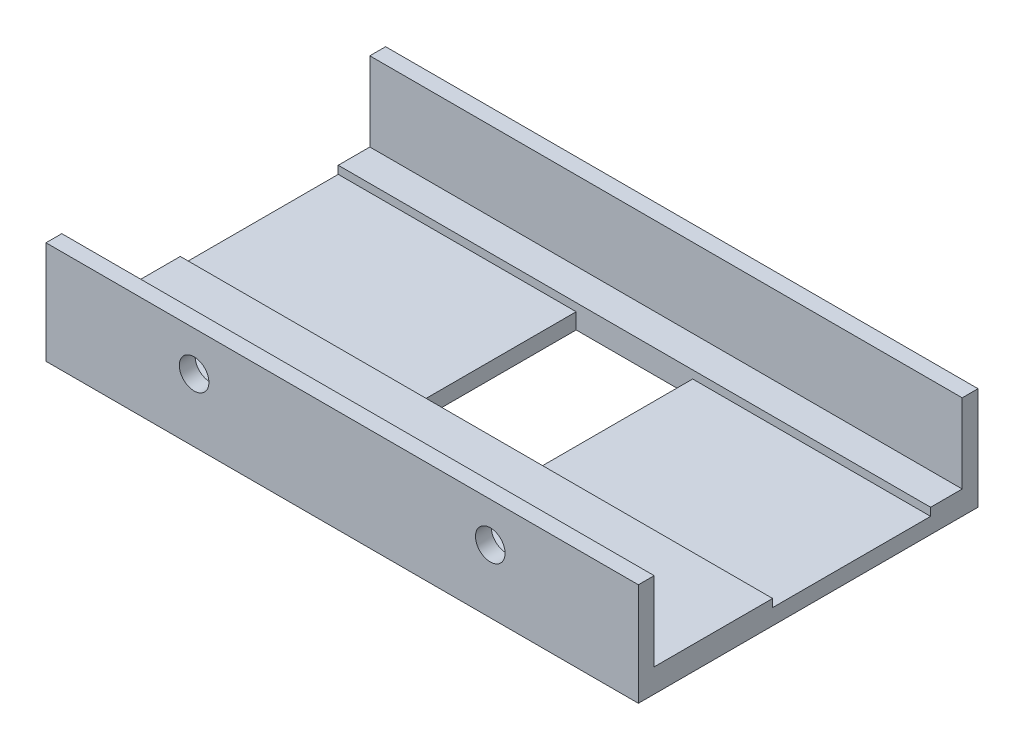
ISO-10303-21;
HEADER;
FILE_DESCRIPTION(('STEP AP214'),'2;1');
FILE_NAME('part.step','',(''),(''),'','','');
FILE_SCHEMA(('AUTOMOTIVE_DESIGN { 1 0 10303 214 1 1 1 1 }'));
ENDSEC;
DATA;
#1=APPLICATION_CONTEXT('core data for automotive mechanical design processes');
#2=APPLICATION_PROTOCOL_DEFINITION('international standard','automotive_design',2000,#1);
#3=PRODUCT_CONTEXT('',#1,'mechanical');
#4=PRODUCT('Part','Part','',(#3));
#5=PRODUCT_RELATED_PRODUCT_CATEGORY('part','',(#4));
#6=PRODUCT_DEFINITION_FORMATION('','',#4);
#7=PRODUCT_DEFINITION_CONTEXT('part definition',#1,'design');
#8=PRODUCT_DEFINITION('design','',#6,#7);
#9=PRODUCT_DEFINITION_SHAPE('','',#8);
#10=(LENGTH_UNIT() NAMED_UNIT(*) SI_UNIT(.MILLI.,.METRE.));
#11=(NAMED_UNIT(*) PLANE_ANGLE_UNIT() SI_UNIT($,.RADIAN.));
#12=(NAMED_UNIT(*) SI_UNIT($,.STERADIAN.) SOLID_ANGLE_UNIT());
#13=UNCERTAINTY_MEASURE_WITH_UNIT(LENGTH_MEASURE(1.E-05),#10,'distance_accuracy_value','');
#14=(GEOMETRIC_REPRESENTATION_CONTEXT(3) GLOBAL_UNCERTAINTY_ASSIGNED_CONTEXT((#13)) GLOBAL_UNIT_ASSIGNED_CONTEXT((#10,
#11,#12)) REPRESENTATION_CONTEXT('',''));
#15=CARTESIAN_POINT('',(0.,0.,0.));
#16=DIRECTION('',(0.,0.,1.));
#17=DIRECTION('',(1.,0.,0.));
#18=AXIS2_PLACEMENT_3D('',#15,#16,#17);
#19=CARTESIAN_POINT('',(37.5,3.,21.5));
#20=DIRECTION('',(0.,1.,0.));
#21=DIRECTION('',(0.,0.,1.));
#22=AXIS2_PLACEMENT_3D('',#19,#20,#21);
#23=PLANE('',#22);
#24=DIRECTION('',(-1.,0.,0.));
#25=VECTOR('',#24,1.);
#26=CARTESIAN_POINT('',(-7.375,3.,-15.5));
#27=LINE('',#26,#25);
#28=CARTESIAN_POINT('',(37.5,3.,-15.5));
#29=VERTEX_POINT('',#28);
#30=CARTESIAN_POINT('',(-37.5,3.,-15.5));
#31=VERTEX_POINT('',#30);
#32=EDGE_CURVE('E184',#29,#31,#27,.T.);
#33=ORIENTED_EDGE('',*,*,#32,.F.);
#34=DIRECTION('',(0.,0.,-1.));
#35=VECTOR('',#34,1.);
#36=CARTESIAN_POINT('',(37.5,3.,-21.5));
#37=LINE('',#36,#35);
#38=CARTESIAN_POINT('',(37.5,3.,-19.5));
#39=VERTEX_POINT('',#38);
#40=EDGE_CURVE('E38',#29,#39,#37,.T.);
#41=ORIENTED_EDGE('',*,*,#40,.T.);
#42=DIRECTION('',(1.,0.,0.));
#43=VECTOR('',#42,1.);
#44=CARTESIAN_POINT('',(-37.5,3.,-19.5));
#45=LINE('',#44,#43);
#46=CARTESIAN_POINT('',(-37.5,3.,-19.5));
#47=VERTEX_POINT('',#46);
#48=EDGE_CURVE('E231',#47,#39,#45,.T.);
#49=ORIENTED_EDGE('',*,*,#48,.F.);
#50=DIRECTION('',(0.,0.,1.));
#51=VECTOR('',#50,1.);
#52=CARTESIAN_POINT('',(-37.5,3.,-21.5));
#53=LINE('',#52,#51);
#54=EDGE_CURVE('E261',#47,#31,#53,.T.);
#55=ORIENTED_EDGE('',*,*,#54,.T.);
#56=EDGE_LOOP('',(#33,#41,#49,#55));
#57=FACE_BOUND('',#56,.T.);
#58=ADVANCED_FACE('F34',(#57),#23,.T.);
#59=CARTESIAN_POINT('',(7.375,0.,-15.5));
#60=DIRECTION('',(1.,0.,0.));
#61=DIRECTION('',(0.,0.,-1.));
#62=AXIS2_PLACEMENT_3D('',#59,#60,#61);
#63=PLANE('',#62);
#64=DIRECTION('',(0.,0.,1.));
#65=VECTOR('',#64,1.);
#66=CARTESIAN_POINT('',(7.375,2.,-15.5));
#67=LINE('',#66,#65);
#68=CARTESIAN_POINT('',(7.375,2.,-15.5));
#69=VERTEX_POINT('',#68);
#70=CARTESIAN_POINT('',(7.375,2.,4.50000000000002));
#71=VERTEX_POINT('',#70);
#72=EDGE_CURVE('E181',#69,#71,#67,.T.);
#73=ORIENTED_EDGE('',*,*,#72,.F.);
#74=DIRECTION('',(0.,1.,0.));
#75=VECTOR('',#74,1.);
#76=CARTESIAN_POINT('',(7.375,0.,-15.5));
#77=LINE('',#76,#75);
#78=CARTESIAN_POINT('',(7.375,0.,-15.5));
#79=VERTEX_POINT('',#78);
#80=EDGE_CURVE('E198',#79,#69,#77,.T.);
#81=ORIENTED_EDGE('',*,*,#80,.F.);
#82=DIRECTION('',(0.,0.,-1.));
#83=VECTOR('',#82,1.);
#84=CARTESIAN_POINT('',(7.375,0.,-15.5));
#85=LINE('',#84,#83);
#86=CARTESIAN_POINT('',(7.375,0.,4.50000000000002));
#87=VERTEX_POINT('',#86);
#88=EDGE_CURVE('E185',#87,#79,#85,.T.);
#89=ORIENTED_EDGE('',*,*,#88,.F.);
#90=DIRECTION('',(0.,1.,0.));
#91=VECTOR('',#90,1.);
#92=CARTESIAN_POINT('',(7.375,0.,4.50000000000002));
#93=LINE('',#92,#91);
#94=EDGE_CURVE('E201',#87,#71,#93,.T.);
#95=ORIENTED_EDGE('',*,*,#94,.T.);
#96=EDGE_LOOP('',(#73,#81,#89,#95));
#97=FACE_BOUND('',#96,.T.);
#98=ADVANCED_FACE('F323',(#97),#63,.F.);
#99=CARTESIAN_POINT('',(-7.375,0.,-15.5));
#100=DIRECTION('',(-1.,0.,0.));
#101=DIRECTION('',(0.,0.,1.));
#102=AXIS2_PLACEMENT_3D('',#99,#100,#101);
#103=PLANE('',#102);
#104=DIRECTION('',(0.,0.,-1.));
#105=VECTOR('',#104,1.);
#106=CARTESIAN_POINT('',(-7.375,2.,-15.5));
#107=LINE('',#106,#105);
#108=CARTESIAN_POINT('',(-7.375,2.,4.50000000000002));
#109=VERTEX_POINT('',#108);
#110=CARTESIAN_POINT('',(-7.375,2.,-15.5));
#111=VERTEX_POINT('',#110);
#112=EDGE_CURVE('E179',#109,#111,#107,.T.);
#113=ORIENTED_EDGE('',*,*,#112,.F.);
#114=DIRECTION('',(0.,1.,0.));
#115=VECTOR('',#114,1.);
#116=CARTESIAN_POINT('',(-7.375,0.,4.50000000000002));
#117=LINE('',#116,#115);
#118=CARTESIAN_POINT('',(-7.375,0.,4.50000000000002));
#119=VERTEX_POINT('',#118);
#120=EDGE_CURVE('E155',#119,#109,#117,.T.);
#121=ORIENTED_EDGE('',*,*,#120,.F.);
#122=DIRECTION('',(0.,0.,1.));
#123=VECTOR('',#122,1.);
#124=CARTESIAN_POINT('',(-7.375,0.,-15.5));
#125=LINE('',#124,#123);
#126=CARTESIAN_POINT('',(-7.375,0.,-15.5));
#127=VERTEX_POINT('',#126);
#128=EDGE_CURVE('E192',#127,#119,#125,.T.);
#129=ORIENTED_EDGE('',*,*,#128,.F.);
#130=DIRECTION('',(0.,1.,0.));
#131=VECTOR('',#130,1.);
#132=CARTESIAN_POINT('',(-7.375,0.,-15.5));
#133=LINE('',#132,#131);
#134=EDGE_CURVE('E206',#127,#111,#133,.T.);
#135=ORIENTED_EDGE('',*,*,#134,.T.);
#136=EDGE_LOOP('',(#113,#121,#129,#135));
#137=FACE_BOUND('',#136,.T.);
#138=ADVANCED_FACE('F328',(#137),#103,.F.);
#139=DIRECTION('',(1.,0.,0.));
#140=VECTOR('',#139,1.);
#141=CARTESIAN_POINT('',(-7.375,3.,4.50000000000002));
#142=LINE('',#141,#140);
#143=CARTESIAN_POINT('',(-37.5,3.,4.50000000000002));
#144=VERTEX_POINT('',#143);
#145=CARTESIAN_POINT('',(37.5,3.,4.50000000000002));
#146=VERTEX_POINT('',#145);
#147=EDGE_CURVE('E189',#144,#146,#142,.T.);
#148=ORIENTED_EDGE('',*,*,#147,.F.);
#149=CARTESIAN_POINT('',(-37.5,3.,19.5));
#150=VERTEX_POINT('',#149);
#151=EDGE_CURVE('E170',#144,#150,#53,.T.);
#152=ORIENTED_EDGE('',*,*,#151,.T.);
#153=DIRECTION('',(-1.,0.,0.));
#154=VECTOR('',#153,1.);
#155=CARTESIAN_POINT('',(-37.5,3.,19.5));
#156=LINE('',#155,#154);
#157=CARTESIAN_POINT('',(37.5,3.,19.5));
#158=VERTEX_POINT('',#157);
#159=EDGE_CURVE('E223',#158,#150,#156,.T.);
#160=ORIENTED_EDGE('',*,*,#159,.F.);
#161=EDGE_CURVE('E272',#158,#146,#37,.T.);
#162=ORIENTED_EDGE('',*,*,#161,.T.);
#163=EDGE_LOOP('',(#148,#152,#160,#162));
#164=FACE_BOUND('',#163,.T.);
#165=ADVANCED_FACE('F316',(#164),#23,.T.);
#166=CARTESIAN_POINT('',(37.5,3.,-21.5));
#167=DIRECTION('',(-1.,0.,0.));
#168=DIRECTION('',(0.,0.,1.));
#169=AXIS2_PLACEMENT_3D('',#166,#167,#168);
#170=PLANE('',#169);
#171=ORIENTED_EDGE('',*,*,#40,.F.);
#172=DIRECTION('',(0.,1.,0.));
#173=VECTOR('',#172,1.);
#174=CARTESIAN_POINT('',(37.5,2.,-15.5));
#175=LINE('',#174,#173);
#176=CARTESIAN_POINT('',(37.5,2.,-15.5));
#177=VERTEX_POINT('',#176);
#178=EDGE_CURVE('E174',#177,#29,#175,.T.);
#179=ORIENTED_EDGE('',*,*,#178,.F.);
#180=DIRECTION('',(0.,0.,-1.));
#181=VECTOR('',#180,1.);
#182=CARTESIAN_POINT('',(37.5,2.,-15.5));
#183=LINE('',#182,#181);
#184=CARTESIAN_POINT('',(37.5,2.,4.50000000000002));
#185=VERTEX_POINT('',#184);
#186=EDGE_CURVE('E156',#185,#177,#183,.T.);
#187=ORIENTED_EDGE('',*,*,#186,.F.);
#188=DIRECTION('',(0.,1.,0.));
#189=VECTOR('',#188,1.);
#190=CARTESIAN_POINT('',(37.5,2.,4.50000000000002));
#191=LINE('',#190,#189);
#192=EDGE_CURVE('E171',#185,#146,#191,.T.);
#193=ORIENTED_EDGE('',*,*,#192,.T.);
#194=ORIENTED_EDGE('',*,*,#161,.F.);
#195=DIRECTION('',(0.,-1.,0.));
#196=VECTOR('',#195,1.);
#197=CARTESIAN_POINT('',(37.5,88.0266619276108,19.5));
#198=LINE('',#197,#196);
#199=CARTESIAN_POINT('',(37.5,13.,19.5));
#200=VERTEX_POINT('',#199);
#201=EDGE_CURVE('E227',#200,#158,#198,.T.);
#202=ORIENTED_EDGE('',*,*,#201,.F.);
#203=DIRECTION('',(0.,0.,-1.));
#204=VECTOR('',#203,1.);
#205=CARTESIAN_POINT('',(37.5,13.,21.5));
#206=LINE('',#205,#204);
#207=CARTESIAN_POINT('',(37.5,13.,21.5));
#208=VERTEX_POINT('',#207);
#209=EDGE_CURVE('E228',#208,#200,#206,.T.);
#210=ORIENTED_EDGE('',*,*,#209,.F.);
#211=DIRECTION('',(0.,-1.,0.));
#212=VECTOR('',#211,1.);
#213=CARTESIAN_POINT('',(37.5,3.,21.5));
#214=LINE('',#213,#212);
#215=CARTESIAN_POINT('',(37.5,0.,21.5));
#216=VERTEX_POINT('',#215);
#217=EDGE_CURVE('E285',#208,#216,#214,.T.);
#218=ORIENTED_EDGE('',*,*,#217,.T.);
#219=DIRECTION('',(0.,0.,-1.));
#220=VECTOR('',#219,1.);
#221=CARTESIAN_POINT('',(37.5,0.,-21.5));
#222=LINE('',#221,#220);
#223=CARTESIAN_POINT('',(37.5,0.,-21.5));
#224=VERTEX_POINT('',#223);
#225=EDGE_CURVE('E269',#216,#224,#222,.T.);
#226=ORIENTED_EDGE('',*,*,#225,.T.);
#227=DIRECTION('',(0.,-1.,0.));
#228=VECTOR('',#227,1.);
#229=CARTESIAN_POINT('',(37.5,3.,-21.5));
#230=LINE('',#229,#228);
#231=CARTESIAN_POINT('',(37.5,13.,-21.5));
#232=VERTEX_POINT('',#231);
#233=EDGE_CURVE('E12',#232,#224,#230,.T.);
#234=ORIENTED_EDGE('',*,*,#233,.F.);
#235=DIRECTION('',(0.,0.,-1.));
#236=VECTOR('',#235,1.);
#237=CARTESIAN_POINT('',(37.5,13.,-21.5));
#238=LINE('',#237,#236);
#239=CARTESIAN_POINT('',(37.5,13.,-19.5));
#240=VERTEX_POINT('',#239);
#241=EDGE_CURVE('E247',#240,#232,#238,.T.);
#242=ORIENTED_EDGE('',*,*,#241,.F.);
#243=DIRECTION('',(0.,-1.,0.));
#244=VECTOR('',#243,1.);
#245=CARTESIAN_POINT('',(37.5,13.,-19.5));
#246=LINE('',#245,#244);
#247=EDGE_CURVE('E253',#240,#39,#246,.T.);
#248=ORIENTED_EDGE('',*,*,#247,.T.);
#249=EDGE_LOOP('',(#171,#179,#187,#193,#194,#202,#210,#218,#226,#234,#242,#248));
#250=FACE_BOUND('',#249,.T.);
#251=ADVANCED_FACE('F36',(#250),#170,.F.);
#252=CARTESIAN_POINT('',(-37.5,3.,-21.5));
#253=DIRECTION('',(0.,0.,1.));
#254=DIRECTION('',(1.,0.,0.));
#255=AXIS2_PLACEMENT_3D('',#252,#253,#254);
#256=PLANE('',#255);
#257=DIRECTION('',(-1.,0.,0.));
#258=VECTOR('',#257,1.);
#259=CARTESIAN_POINT('',(-37.5,0.,-21.5));
#260=LINE('',#259,#258);
#261=CARTESIAN_POINT('',(-37.5,0.,-21.5));
#262=VERTEX_POINT('',#261);
#263=EDGE_CURVE('E279',#224,#262,#260,.T.);
#264=ORIENTED_EDGE('',*,*,#263,.T.);
#265=DIRECTION('',(0.,-1.,0.));
#266=VECTOR('',#265,1.);
#267=CARTESIAN_POINT('',(-37.5,3.,-21.5));
#268=LINE('',#267,#266);
#269=CARTESIAN_POINT('',(-37.5,13.,-21.5));
#270=VERTEX_POINT('',#269);
#271=EDGE_CURVE('E44',#270,#262,#268,.T.);
#272=ORIENTED_EDGE('',*,*,#271,.F.);
#273=DIRECTION('',(-1.,0.,0.));
#274=VECTOR('',#273,1.);
#275=CARTESIAN_POINT('',(-37.5,13.,-21.5));
#276=LINE('',#275,#274);
#277=EDGE_CURVE('E250',#232,#270,#276,.T.);
#278=ORIENTED_EDGE('',*,*,#277,.F.);
#279=ORIENTED_EDGE('',*,*,#233,.T.);
#280=EDGE_LOOP('',(#264,#272,#278,#279));
#281=FACE_BOUND('',#280,.T.);
#282=ADVANCED_FACE('F343',(#281),#256,.F.);
#283=CARTESIAN_POINT('',(-37.5,3.,-21.5));
#284=DIRECTION('',(1.,0.,0.));
#285=DIRECTION('',(0.,0.,-1.));
#286=AXIS2_PLACEMENT_3D('',#283,#284,#285);
#287=PLANE('',#286);
#288=DIRECTION('',(0.,0.,1.));
#289=VECTOR('',#288,1.);
#290=CARTESIAN_POINT('',(-37.5,2.,-15.5));
#291=LINE('',#290,#289);
#292=CARTESIAN_POINT('',(-37.5,2.,-15.5));
#293=VERTEX_POINT('',#292);
#294=CARTESIAN_POINT('',(-37.5,2.,4.50000000000002));
#295=VERTEX_POINT('',#294);
#296=EDGE_CURVE('E160',#293,#295,#291,.T.);
#297=ORIENTED_EDGE('',*,*,#296,.F.);
#298=DIRECTION('',(0.,1.,0.));
#299=VECTOR('',#298,1.);
#300=CARTESIAN_POINT('',(-37.5,2.,-15.5));
#301=LINE('',#300,#299);
#302=EDGE_CURVE('E182',#293,#31,#301,.T.);
#303=ORIENTED_EDGE('',*,*,#302,.T.);
#304=ORIENTED_EDGE('',*,*,#54,.F.);
#305=DIRECTION('',(0.,-1.,0.));
#306=VECTOR('',#305,1.);
#307=CARTESIAN_POINT('',(-37.5,13.,-19.5));
#308=LINE('',#307,#306);
#309=CARTESIAN_POINT('',(-37.5,13.,-19.5));
#310=VERTEX_POINT('',#309);
#311=EDGE_CURVE('E264',#310,#47,#308,.T.);
#312=ORIENTED_EDGE('',*,*,#311,.F.);
#313=DIRECTION('',(0.,0.,1.));
#314=VECTOR('',#313,1.);
#315=CARTESIAN_POINT('',(-37.5,13.,-21.5));
#316=LINE('',#315,#314);
#317=EDGE_CURVE('E242',#270,#310,#316,.T.);
#318=ORIENTED_EDGE('',*,*,#317,.F.);
#319=ORIENTED_EDGE('',*,*,#271,.T.);
#320=DIRECTION('',(0.,0.,1.));
#321=VECTOR('',#320,1.);
#322=CARTESIAN_POINT('',(-37.5,0.,-21.5));
#323=LINE('',#322,#321);
#324=CARTESIAN_POINT('',(-37.5,0.,21.5));
#325=VERTEX_POINT('',#324);
#326=EDGE_CURVE('E281',#262,#325,#323,.T.);
#327=ORIENTED_EDGE('',*,*,#326,.T.);
#328=DIRECTION('',(0.,-1.,0.));
#329=VECTOR('',#328,1.);
#330=CARTESIAN_POINT('',(-37.5,3.,21.5));
#331=LINE('',#330,#329);
#332=CARTESIAN_POINT('',(-37.5,13.,21.5));
#333=VERTEX_POINT('',#332);
#334=EDGE_CURVE('E288',#333,#325,#331,.T.);
#335=ORIENTED_EDGE('',*,*,#334,.F.);
#336=DIRECTION('',(0.,0.,1.));
#337=VECTOR('',#336,1.);
#338=CARTESIAN_POINT('',(-37.5,13.,21.5));
#339=LINE('',#338,#337);
#340=CARTESIAN_POINT('',(-37.5,13.,19.5));
#341=VERTEX_POINT('',#340);
#342=EDGE_CURVE('E235',#341,#333,#339,.T.);
#343=ORIENTED_EDGE('',*,*,#342,.F.);
#344=DIRECTION('',(0.,-1.,0.));
#345=VECTOR('',#344,1.);
#346=CARTESIAN_POINT('',(-37.5,88.0266619276108,19.5));
#347=LINE('',#346,#345);
#348=EDGE_CURVE('E222',#341,#150,#347,.T.);
#349=ORIENTED_EDGE('',*,*,#348,.T.);
#350=ORIENTED_EDGE('',*,*,#151,.F.);
#351=DIRECTION('',(0.,1.,0.));
#352=VECTOR('',#351,1.);
#353=CARTESIAN_POINT('',(-37.5,2.,4.50000000000002));
#354=LINE('',#353,#352);
#355=EDGE_CURVE('E152',#295,#144,#354,.T.);
#356=ORIENTED_EDGE('',*,*,#355,.F.);
#357=EDGE_LOOP('',(#297,#303,#304,#312,#318,#319,#327,#335,#343,#349,#350,#356));
#358=FACE_BOUND('',#357,.T.);
#359=ADVANCED_FACE('F168',(#358),#287,.F.);
#360=CARTESIAN_POINT('',(-37.5,3.,21.5));
#361=DIRECTION('',(0.,0.,-1.));
#362=DIRECTION('',(-1.,0.,0.));
#363=AXIS2_PLACEMENT_3D('',#360,#361,#362);
#364=PLANE('',#363);
#365=CARTESIAN_POINT('',(18.75,7.99999999999999,21.5));
#366=DIRECTION('',(0.,0.,1.));
#367=DIRECTION('',(-1.,0.,0.));
#368=AXIS2_PLACEMENT_3D('',#365,#366,#367);
#369=CIRCLE('',#368,1.875);
#370=CARTESIAN_POINT('',(16.875,7.99999999999999,21.5));
#371=VERTEX_POINT('',#370);
#372=EDGE_CURVE('E204',#371,#371,#369,.T.);
#373=ORIENTED_EDGE('',*,*,#372,.F.);
#374=EDGE_LOOP('',(#373));
#375=FACE_BOUND('',#374,.T.);
#376=CARTESIAN_POINT('',(-18.75,7.99999999999999,21.5));
#377=DIRECTION('',(0.,0.,1.));
#378=DIRECTION('',(1.,0.,0.));
#379=AXIS2_PLACEMENT_3D('',#376,#377,#378);
#380=CIRCLE('',#379,1.875);
#381=CARTESIAN_POINT('',(-16.875,7.99999999999999,21.5));
#382=VERTEX_POINT('',#381);
#383=EDGE_CURVE('E216',#382,#382,#380,.T.);
#384=ORIENTED_EDGE('',*,*,#383,.F.);
#385=EDGE_LOOP('',(#384));
#386=FACE_BOUND('',#385,.T.);
#387=DIRECTION('',(1.,0.,0.));
#388=VECTOR('',#387,1.);
#389=CARTESIAN_POINT('',(-37.5,0.,21.5));
#390=LINE('',#389,#388);
#391=EDGE_CURVE('E283',#325,#216,#390,.T.);
#392=ORIENTED_EDGE('',*,*,#391,.T.);
#393=ORIENTED_EDGE('',*,*,#217,.F.);
#394=DIRECTION('',(1.,0.,0.));
#395=VECTOR('',#394,1.);
#396=CARTESIAN_POINT('',(-37.5,13.,21.5));
#397=LINE('',#396,#395);
#398=EDGE_CURVE('E232',#333,#208,#397,.T.);
#399=ORIENTED_EDGE('',*,*,#398,.F.);
#400=ORIENTED_EDGE('',*,*,#334,.T.);
#401=EDGE_LOOP('',(#392,#393,#399,#400));
#402=FACE_BOUND('',#401,.T.);
#403=ADVANCED_FACE('F302',(#375,#386,#402),#364,.F.);
#404=CARTESIAN_POINT('',(37.5,0.,21.5));
#405=DIRECTION('',(0.,1.,0.));
#406=DIRECTION('',(0.,0.,1.));
#407=AXIS2_PLACEMENT_3D('',#404,#405,#406);
#408=PLANE('',#407);
#409=DIRECTION('',(1.,0.,0.));
#410=VECTOR('',#409,1.);
#411=CARTESIAN_POINT('',(-7.375,0.,4.50000000000002));
#412=LINE('',#411,#410);
#413=EDGE_CURVE('E195',#119,#87,#412,.T.);
#414=ORIENTED_EDGE('',*,*,#413,.T.);
#415=ORIENTED_EDGE('',*,*,#88,.T.);
#416=DIRECTION('',(-1.,0.,0.));
#417=VECTOR('',#416,1.);
#418=CARTESIAN_POINT('',(-7.375,0.,-15.5));
#419=LINE('',#418,#417);
#420=EDGE_CURVE('E188',#79,#127,#419,.T.);
#421=ORIENTED_EDGE('',*,*,#420,.T.);
#422=ORIENTED_EDGE('',*,*,#128,.T.);
#423=EDGE_LOOP('',(#414,#415,#421,#422));
#424=FACE_BOUND('',#423,.T.);
#425=ORIENTED_EDGE('',*,*,#225,.F.);
#426=ORIENTED_EDGE('',*,*,#391,.F.);
#427=ORIENTED_EDGE('',*,*,#326,.F.);
#428=ORIENTED_EDGE('',*,*,#263,.F.);
#429=EDGE_LOOP('',(#425,#426,#427,#428));
#430=FACE_BOUND('',#429,.T.);
#431=ADVANCED_FACE('F300',(#424,#430),#408,.F.);
#432=CARTESIAN_POINT('',(-37.5,13.,-19.5));
#433=DIRECTION('',(0.,0.,-1.));
#434=DIRECTION('',(-1.,0.,0.));
#435=AXIS2_PLACEMENT_3D('',#432,#433,#434);
#436=PLANE('',#435);
#437=ORIENTED_EDGE('',*,*,#48,.T.);
#438=ORIENTED_EDGE('',*,*,#247,.F.);
#439=DIRECTION('',(1.,0.,0.));
#440=VECTOR('',#439,1.);
#441=CARTESIAN_POINT('',(-37.5,13.,-19.5));
#442=LINE('',#441,#440);
#443=EDGE_CURVE('E245',#310,#240,#442,.T.);
#444=ORIENTED_EDGE('',*,*,#443,.F.);
#445=ORIENTED_EDGE('',*,*,#311,.T.);
#446=EDGE_LOOP('',(#437,#438,#444,#445));
#447=FACE_BOUND('',#446,.T.);
#448=ADVANCED_FACE('F340',(#447),#436,.F.);
#449=CARTESIAN_POINT('',(-37.5,13.,-19.5));
#450=DIRECTION('',(0.,1.,0.));
#451=DIRECTION('',(0.,0.,1.));
#452=AXIS2_PLACEMENT_3D('',#449,#450,#451);
#453=PLANE('',#452);
#454=ORIENTED_EDGE('',*,*,#317,.T.);
#455=ORIENTED_EDGE('',*,*,#443,.T.);
#456=ORIENTED_EDGE('',*,*,#241,.T.);
#457=ORIENTED_EDGE('',*,*,#277,.T.);
#458=EDGE_LOOP('',(#454,#455,#456,#457));
#459=FACE_BOUND('',#458,.T.);
#460=ADVANCED_FACE('F342',(#459),#453,.T.);
#461=CARTESIAN_POINT('',(-37.5,88.0266619276108,19.5));
#462=DIRECTION('',(0.,0.,1.));
#463=DIRECTION('',(1.,0.,0.));
#464=AXIS2_PLACEMENT_3D('',#461,#462,#463);
#465=PLANE('',#464);
#466=CARTESIAN_POINT('',(18.75,7.99999999999999,19.5));
#467=DIRECTION('',(0.,0.,1.));
#468=DIRECTION('',(1.,0.,0.));
#469=AXIS2_PLACEMENT_3D('',#466,#467,#468);
#470=CIRCLE('',#469,1.875);
#471=CARTESIAN_POINT('',(20.625,7.99999999999999,19.5));
#472=VERTEX_POINT('',#471);
#473=EDGE_CURVE('E213',#472,#472,#470,.F.);
#474=ORIENTED_EDGE('',*,*,#473,.F.);
#475=EDGE_LOOP('',(#474));
#476=FACE_BOUND('',#475,.T.);
#477=CARTESIAN_POINT('',(-18.75,7.99999999999999,19.5));
#478=DIRECTION('',(0.,0.,1.));
#479=DIRECTION('',(1.,0.,0.));
#480=AXIS2_PLACEMENT_3D('',#477,#478,#479);
#481=CIRCLE('',#480,1.875);
#482=CARTESIAN_POINT('',(-16.875,7.99999999999999,19.5));
#483=VERTEX_POINT('',#482);
#484=EDGE_CURVE('E219',#483,#483,#481,.F.);
#485=ORIENTED_EDGE('',*,*,#484,.F.);
#486=EDGE_LOOP('',(#485));
#487=FACE_BOUND('',#486,.T.);
#488=DIRECTION('',(-1.,0.,0.));
#489=VECTOR('',#488,1.);
#490=CARTESIAN_POINT('',(-37.5,13.,19.5));
#491=LINE('',#490,#489);
#492=EDGE_CURVE('E226',#200,#341,#491,.T.);
#493=ORIENTED_EDGE('',*,*,#492,.F.);
#494=ORIENTED_EDGE('',*,*,#201,.T.);
#495=ORIENTED_EDGE('',*,*,#159,.T.);
#496=ORIENTED_EDGE('',*,*,#348,.F.);
#497=EDGE_LOOP('',(#493,#494,#495,#496));
#498=FACE_BOUND('',#497,.T.);
#499=ADVANCED_FACE('F314',(#476,#487,#498),#465,.F.);
#500=CARTESIAN_POINT('',(-37.5,13.,-19.5));
#501=DIRECTION('',(0.,1.,0.));
#502=DIRECTION('',(0.,0.,1.));
#503=AXIS2_PLACEMENT_3D('',#500,#501,#502);
#504=PLANE('',#503);
#505=ORIENTED_EDGE('',*,*,#492,.T.);
#506=ORIENTED_EDGE('',*,*,#342,.T.);
#507=ORIENTED_EDGE('',*,*,#398,.T.);
#508=ORIENTED_EDGE('',*,*,#209,.T.);
#509=EDGE_LOOP('',(#505,#506,#507,#508));
#510=FACE_BOUND('',#509,.T.);
#511=ADVANCED_FACE('F310',(#510),#504,.T.);
#512=CARTESIAN_POINT('',(-18.75,7.99999999999999,-62.1164995573812));
#513=DIRECTION('',(0.,0.,1.));
#514=DIRECTION('',(1.,0.,0.));
#515=AXIS2_PLACEMENT_3D('',#512,#513,#514);
#516=CYLINDRICAL_SURFACE('',#515,1.875);
#517=ORIENTED_EDGE('',*,*,#484,.T.);
#518=EDGE_LOOP('',(#517));
#519=FACE_BOUND('',#518,.T.);
#520=ORIENTED_EDGE('',*,*,#383,.T.);
#521=EDGE_LOOP('',(#520));
#522=FACE_BOUND('',#521,.T.);
#523=ADVANCED_FACE('F373',(#519,#522),#516,.F.);
#524=CARTESIAN_POINT('',(18.75,7.99999999999999,-62.1164995573812));
#525=DIRECTION('',(0.,0.,1.));
#526=DIRECTION('',(1.,0.,0.));
#527=AXIS2_PLACEMENT_3D('',#524,#525,#526);
#528=CYLINDRICAL_SURFACE('',#527,1.875);
#529=ORIENTED_EDGE('',*,*,#473,.T.);
#530=EDGE_LOOP('',(#529));
#531=FACE_BOUND('',#530,.T.);
#532=ORIENTED_EDGE('',*,*,#372,.T.);
#533=EDGE_LOOP('',(#532));
#534=FACE_BOUND('',#533,.T.);
#535=ADVANCED_FACE('F370',(#531,#534),#528,.F.);
#536=CARTESIAN_POINT('',(-7.375,0.,4.50000000000002));
#537=DIRECTION('',(0.,0.,1.));
#538=DIRECTION('',(1.,0.,0.));
#539=AXIS2_PLACEMENT_3D('',#536,#537,#538);
#540=PLANE('',#539);
#541=ORIENTED_EDGE('',*,*,#147,.T.);
#542=ORIENTED_EDGE('',*,*,#192,.F.);
#543=DIRECTION('',(1.,0.,0.));
#544=VECTOR('',#543,1.);
#545=CARTESIAN_POINT('',(-37.5,2.,4.50000000000002));
#546=LINE('',#545,#544);
#547=EDGE_CURVE('E157',#71,#185,#546,.T.);
#548=ORIENTED_EDGE('',*,*,#547,.F.);
#549=ORIENTED_EDGE('',*,*,#94,.F.);
#550=ORIENTED_EDGE('',*,*,#413,.F.);
#551=ORIENTED_EDGE('',*,*,#120,.T.);
#552=EDGE_CURVE('E52',#295,#109,#546,.T.);
#553=ORIENTED_EDGE('',*,*,#552,.F.);
#554=ORIENTED_EDGE('',*,*,#355,.T.);
#555=EDGE_LOOP('',(#541,#542,#548,#549,#550,#551,#553,#554));
#556=FACE_BOUND('',#555,.T.);
#557=ADVANCED_FACE('F150',(#556),#540,.F.);
#558=CARTESIAN_POINT('',(-7.375,0.,-15.5));
#559=DIRECTION('',(0.,0.,-1.));
#560=DIRECTION('',(-1.,0.,0.));
#561=AXIS2_PLACEMENT_3D('',#558,#559,#560);
#562=PLANE('',#561);
#563=ORIENTED_EDGE('',*,*,#32,.T.);
#564=ORIENTED_EDGE('',*,*,#302,.F.);
#565=DIRECTION('',(-1.,0.,0.));
#566=VECTOR('',#565,1.);
#567=CARTESIAN_POINT('',(-37.5,2.,-15.5));
#568=LINE('',#567,#566);
#569=EDGE_CURVE('E163',#111,#293,#568,.T.);
#570=ORIENTED_EDGE('',*,*,#569,.F.);
#571=ORIENTED_EDGE('',*,*,#134,.F.);
#572=ORIENTED_EDGE('',*,*,#420,.F.);
#573=ORIENTED_EDGE('',*,*,#80,.T.);
#574=EDGE_CURVE('E60',#177,#69,#568,.T.);
#575=ORIENTED_EDGE('',*,*,#574,.F.);
#576=ORIENTED_EDGE('',*,*,#178,.T.);
#577=EDGE_LOOP('',(#563,#564,#570,#571,#572,#573,#575,#576));
#578=FACE_BOUND('',#577,.T.);
#579=ADVANCED_FACE('F330',(#578),#562,.F.);
#580=CARTESIAN_POINT('',(-37.5,2.,4.50000000000002));
#581=DIRECTION('',(0.,1.,0.));
#582=DIRECTION('',(0.,0.,1.));
#583=AXIS2_PLACEMENT_3D('',#580,#581,#582);
#584=PLANE('',#583);
#585=ORIENTED_EDGE('',*,*,#112,.T.);
#586=ORIENTED_EDGE('',*,*,#569,.T.);
#587=ORIENTED_EDGE('',*,*,#296,.T.);
#588=ORIENTED_EDGE('',*,*,#552,.T.);
#589=EDGE_LOOP('',(#585,#586,#587,#588));
#590=FACE_BOUND('',#589,.T.);
#591=ADVANCED_FACE('F161',(#590),#584,.T.);
#592=ORIENTED_EDGE('',*,*,#72,.T.);
#593=ORIENTED_EDGE('',*,*,#547,.T.);
#594=ORIENTED_EDGE('',*,*,#186,.T.);
#595=ORIENTED_EDGE('',*,*,#574,.T.);
#596=EDGE_LOOP('',(#592,#593,#594,#595));
#597=FACE_BOUND('',#596,.T.);
#598=ADVANCED_FACE('F435',(#597),#584,.T.);
#599=CLOSED_SHELL('',(#58,#98,#138,#165,#251,#282,#359,#403,#431,#448,#460,#499,#511,#523,#535,
#557,#579,#591,#598));
#600=MANIFOLD_SOLID_BREP('B2',#599);
#601=ADVANCED_BREP_SHAPE_REPRESENTATION('',(#18,#600),#14);
#602=SHAPE_DEFINITION_REPRESENTATION(#9,#601);
ENDSEC;
END-ISO-10303-21;
